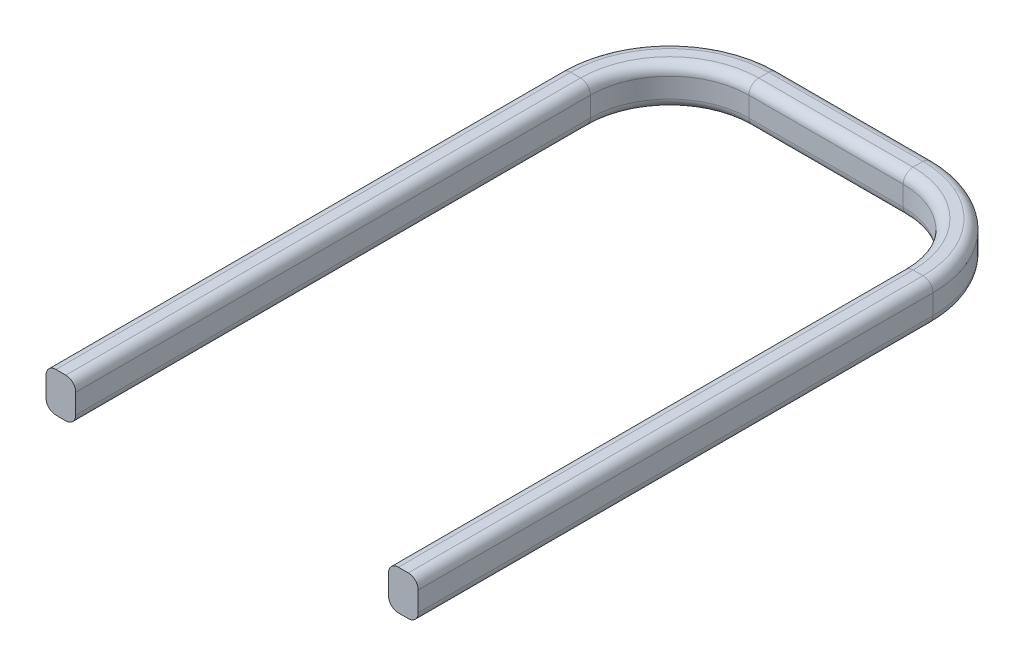
ISO-10303-21;
HEADER;
FILE_DESCRIPTION(('STEP AP214'),'2;1');
FILE_NAME('part.step','',(''),(''),'','','');
FILE_SCHEMA(('AUTOMOTIVE_DESIGN { 1 0 10303 214 1 1 1 1 }'));
ENDSEC;
DATA;
#1=APPLICATION_CONTEXT('core data for automotive mechanical design processes');
#2=APPLICATION_PROTOCOL_DEFINITION('international standard','automotive_design',2000,#1);
#3=PRODUCT_CONTEXT('',#1,'mechanical');
#4=PRODUCT('Part','Part','',(#3));
#5=PRODUCT_RELATED_PRODUCT_CATEGORY('part','',(#4));
#6=PRODUCT_DEFINITION_FORMATION('','',#4);
#7=PRODUCT_DEFINITION_CONTEXT('part definition',#1,'design');
#8=PRODUCT_DEFINITION('design','',#6,#7);
#9=PRODUCT_DEFINITION_SHAPE('','',#8);
#10=(LENGTH_UNIT() NAMED_UNIT(*) SI_UNIT(.MILLI.,.METRE.));
#11=(NAMED_UNIT(*) PLANE_ANGLE_UNIT() SI_UNIT($,.RADIAN.));
#12=(NAMED_UNIT(*) SI_UNIT($,.STERADIAN.) SOLID_ANGLE_UNIT());
#13=UNCERTAINTY_MEASURE_WITH_UNIT(LENGTH_MEASURE(1.E-05),#10,'distance_accuracy_value','');
#14=(GEOMETRIC_REPRESENTATION_CONTEXT(3) GLOBAL_UNCERTAINTY_ASSIGNED_CONTEXT((#13)) GLOBAL_UNIT_ASSIGNED_CONTEXT((#10,
#11,#12)) REPRESENTATION_CONTEXT('',''));
#15=CARTESIAN_POINT('',(0.,0.,0.));
#16=DIRECTION('',(0.,0.,1.));
#17=DIRECTION('',(1.,0.,0.));
#18=AXIS2_PLACEMENT_3D('',#15,#16,#17);
#19=CARTESIAN_POINT('',(0.,0.,0.));
#20=DIRECTION('',(0.,0.,1.));
#21=DIRECTION('',(1.,0.,0.));
#22=AXIS2_PLACEMENT_3D('',#19,#20,#21);
#23=PLANE('',#22);
#24=DIRECTION('',(0.,-1.,0.));
#25=VECTOR('',#24,1.);
#26=CARTESIAN_POINT('',(-4.7,0.,0.));
#27=LINE('',#26,#25);
#28=CARTESIAN_POINT('',(-4.7,0.75,0.));
#29=VERTEX_POINT('',#28);
#30=CARTESIAN_POINT('',(-4.7,0.25,0.));
#31=VERTEX_POINT('',#30);
#32=EDGE_CURVE('E458',#29,#31,#27,.T.);
#33=ORIENTED_EDGE('',*,*,#32,.T.);
#34=CARTESIAN_POINT('',(-4.45,0.25,0.));
#35=DIRECTION('',(0.,0.,1.));
#36=DIRECTION('',(1.,0.,0.));
#37=AXIS2_PLACEMENT_3D('',#34,#35,#36);
#38=CIRCLE('',#37,0.25);
#39=CARTESIAN_POINT('',(-4.45,0.,0.));
#40=VERTEX_POINT('',#39);
#41=EDGE_CURVE('E362',#31,#40,#38,.T.);
#42=ORIENTED_EDGE('',*,*,#41,.T.);
#43=DIRECTION('',(1.,0.,0.));
#44=VECTOR('',#43,1.);
#45=CARTESIAN_POINT('',(-3.95,0.,0.));
#46=LINE('',#45,#44);
#47=CARTESIAN_POINT('',(-4.2,0.,0.));
#48=VERTEX_POINT('',#47);
#49=EDGE_CURVE('E464',#40,#48,#46,.T.);
#50=ORIENTED_EDGE('',*,*,#49,.T.);
#51=CARTESIAN_POINT('',(-4.2,0.25,0.));
#52=DIRECTION('',(0.,0.,1.));
#53=DIRECTION('',(1.,0.,0.));
#54=AXIS2_PLACEMENT_3D('',#51,#52,#53);
#55=CIRCLE('',#54,0.25);
#56=CARTESIAN_POINT('',(-3.95,0.25,0.));
#57=VERTEX_POINT('',#56);
#58=EDGE_CURVE('E356',#48,#57,#55,.T.);
#59=ORIENTED_EDGE('',*,*,#58,.T.);
#60=DIRECTION('',(0.,1.,0.));
#61=VECTOR('',#60,1.);
#62=CARTESIAN_POINT('',(-3.95,0.,0.));
#63=LINE('',#62,#61);
#64=CARTESIAN_POINT('',(-3.95,0.75,0.));
#65=VERTEX_POINT('',#64);
#66=EDGE_CURVE('E388',#57,#65,#63,.T.);
#67=ORIENTED_EDGE('',*,*,#66,.T.);
#68=CARTESIAN_POINT('',(-4.2,0.75,0.));
#69=DIRECTION('',(0.,0.,1.));
#70=DIRECTION('',(1.,0.,0.));
#71=AXIS2_PLACEMENT_3D('',#68,#69,#70);
#72=CIRCLE('',#71,0.25);
#73=CARTESIAN_POINT('',(-4.2,1.,0.));
#74=VERTEX_POINT('',#73);
#75=EDGE_CURVE('E64',#65,#74,#72,.T.);
#76=ORIENTED_EDGE('',*,*,#75,.T.);
#77=DIRECTION('',(-1.,0.,0.));
#78=VECTOR('',#77,1.);
#79=CARTESIAN_POINT('',(-3.95,1.,0.));
#80=LINE('',#79,#78);
#81=CARTESIAN_POINT('',(-4.45,1.,0.));
#82=VERTEX_POINT('',#81);
#83=EDGE_CURVE('E455',#74,#82,#80,.T.);
#84=ORIENTED_EDGE('',*,*,#83,.T.);
#85=CARTESIAN_POINT('',(-4.45,0.75,0.));
#86=DIRECTION('',(0.,0.,1.));
#87=DIRECTION('',(1.,0.,0.));
#88=AXIS2_PLACEMENT_3D('',#85,#86,#87);
#89=CIRCLE('',#88,0.25);
#90=EDGE_CURVE('E359',#82,#29,#89,.T.);
#91=ORIENTED_EDGE('',*,*,#90,.T.);
#92=EDGE_LOOP('',(#33,#42,#50,#59,#67,#76,#84,#91));
#93=FACE_BOUND('',#92,.T.);
#94=ADVANCED_FACE('F39',(#93),#23,.T.);
#95=CARTESIAN_POINT('',(0.,0.,0.));
#96=DIRECTION('',(0.,0.,-1.));
#97=DIRECTION('',(-1.,0.,0.));
#98=AXIS2_PLACEMENT_3D('',#95,#96,#97);
#99=PLANE('',#98);
#100=DIRECTION('',(-1.,0.,0.));
#101=VECTOR('',#100,1.);
#102=CARTESIAN_POINT('',(3.95,0.,0.));
#103=LINE('',#102,#101);
#104=CARTESIAN_POINT('',(4.45,0.,0.));
#105=VERTEX_POINT('',#104);
#106=CARTESIAN_POINT('',(4.2,0.,0.));
#107=VERTEX_POINT('',#106);
#108=EDGE_CURVE('E222',#105,#107,#103,.T.);
#109=ORIENTED_EDGE('',*,*,#108,.F.);
#110=CARTESIAN_POINT('',(4.45,0.25,0.));
#111=DIRECTION('',(0.,0.,-1.));
#112=DIRECTION('',(-1.,0.,0.));
#113=AXIS2_PLACEMENT_3D('',#110,#111,#112);
#114=CIRCLE('',#113,0.25);
#115=CARTESIAN_POINT('',(4.7,0.25,0.));
#116=VERTEX_POINT('',#115);
#117=EDGE_CURVE('E204',#105,#116,#114,.F.);
#118=ORIENTED_EDGE('',*,*,#117,.T.);
#119=DIRECTION('',(0.,-1.,0.));
#120=VECTOR('',#119,1.);
#121=CARTESIAN_POINT('',(4.7,0.,0.));
#122=LINE('',#121,#120);
#123=CARTESIAN_POINT('',(4.7,0.75,0.));
#124=VERTEX_POINT('',#123);
#125=EDGE_CURVE('E235',#124,#116,#122,.T.);
#126=ORIENTED_EDGE('',*,*,#125,.F.);
#127=CARTESIAN_POINT('',(4.45,0.75,0.));
#128=DIRECTION('',(0.,0.,-1.));
#129=DIRECTION('',(-1.,0.,0.));
#130=AXIS2_PLACEMENT_3D('',#127,#128,#129);
#131=CIRCLE('',#130,0.25);
#132=CARTESIAN_POINT('',(4.45,1.,0.));
#133=VERTEX_POINT('',#132);
#134=EDGE_CURVE('E216',#124,#133,#131,.F.);
#135=ORIENTED_EDGE('',*,*,#134,.T.);
#136=DIRECTION('',(1.,0.,0.));
#137=VECTOR('',#136,1.);
#138=CARTESIAN_POINT('',(3.95,1.,0.));
#139=LINE('',#138,#137);
#140=CARTESIAN_POINT('',(4.2,1.,0.));
#141=VERTEX_POINT('',#140);
#142=EDGE_CURVE('E240',#141,#133,#139,.T.);
#143=ORIENTED_EDGE('',*,*,#142,.F.);
#144=CARTESIAN_POINT('',(4.2,0.75,0.));
#145=DIRECTION('',(0.,0.,-1.));
#146=DIRECTION('',(-1.,0.,0.));
#147=AXIS2_PLACEMENT_3D('',#144,#145,#146);
#148=CIRCLE('',#147,0.25);
#149=CARTESIAN_POINT('',(3.95,0.75,0.));
#150=VERTEX_POINT('',#149);
#151=EDGE_CURVE('E228',#141,#150,#148,.F.);
#152=ORIENTED_EDGE('',*,*,#151,.T.);
#153=DIRECTION('',(0.,1.,0.));
#154=VECTOR('',#153,1.);
#155=CARTESIAN_POINT('',(3.95,0.,0.));
#156=LINE('',#155,#154);
#157=CARTESIAN_POINT('',(3.95,0.25,0.));
#158=VERTEX_POINT('',#157);
#159=EDGE_CURVE('E483',#158,#150,#156,.T.);
#160=ORIENTED_EDGE('',*,*,#159,.F.);
#161=CARTESIAN_POINT('',(4.2,0.25,0.));
#162=DIRECTION('',(0.,0.,-1.));
#163=DIRECTION('',(-1.,0.,0.));
#164=AXIS2_PLACEMENT_3D('',#161,#162,#163);
#165=CIRCLE('',#164,0.25);
#166=EDGE_CURVE('E233',#158,#107,#165,.F.);
#167=ORIENTED_EDGE('',*,*,#166,.T.);
#168=EDGE_LOOP('',(#109,#118,#126,#135,#143,#152,#160,#167));
#169=FACE_BOUND('',#168,.T.);
#170=ADVANCED_FACE('F231',(#169),#99,.F.);
#171=CARTESIAN_POINT('',(-3.95,0.,0.));
#172=DIRECTION('',(-1.,0.,0.));
#173=DIRECTION('',(0.,0.,1.));
#174=AXIS2_PLACEMENT_3D('',#171,#172,#173);
#175=PLANE('',#174);
#176=ORIENTED_EDGE('',*,*,#66,.F.);
#177=DIRECTION('',(0.,0.,-1.));
#178=VECTOR('',#177,1.);
#179=CARTESIAN_POINT('',(-3.95,0.25,0.));
#180=LINE('',#179,#178);
#181=CARTESIAN_POINT('',(-3.95,0.25,-13.));
#182=VERTEX_POINT('',#181);
#183=EDGE_CURVE('E11',#57,#182,#180,.T.);
#184=ORIENTED_EDGE('',*,*,#183,.T.);
#185=DIRECTION('',(0.,1.,0.));
#186=VECTOR('',#185,1.);
#187=CARTESIAN_POINT('',(-3.95,0.,-13.));
#188=LINE('',#187,#186);
#189=CARTESIAN_POINT('',(-3.95,0.75,-13.));
#190=VERTEX_POINT('',#189);
#191=EDGE_CURVE('E450',#182,#190,#188,.T.);
#192=ORIENTED_EDGE('',*,*,#191,.T.);
#193=DIRECTION('',(0.,0.,-1.));
#194=VECTOR('',#193,1.);
#195=CARTESIAN_POINT('',(-3.95,0.75,0.));
#196=LINE('',#195,#194);
#197=EDGE_CURVE('E49',#190,#65,#196,.F.);
#198=ORIENTED_EDGE('',*,*,#197,.T.);
#199=EDGE_LOOP('',(#176,#184,#192,#198));
#200=FACE_BOUND('',#199,.T.);
#201=ADVANCED_FACE('F447',(#200),#175,.F.);
#202=CARTESIAN_POINT('',(-3.95,1.,0.));
#203=DIRECTION('',(0.,-1.,0.));
#204=DIRECTION('',(0.,0.,-1.));
#205=AXIS2_PLACEMENT_3D('',#202,#203,#204);
#206=PLANE('',#205);
#207=DIRECTION('',(-1.,0.,0.));
#208=VECTOR('',#207,1.);
#209=CARTESIAN_POINT('',(-3.95,1.,-13.));
#210=LINE('',#209,#208);
#211=CARTESIAN_POINT('',(-4.2,1.,-13.));
#212=VERTEX_POINT('',#211);
#213=CARTESIAN_POINT('',(-4.45,1.,-13.));
#214=VERTEX_POINT('',#213);
#215=EDGE_CURVE('E463',#212,#214,#210,.T.);
#216=ORIENTED_EDGE('',*,*,#215,.T.);
#217=DIRECTION('',(0.,0.,-1.));
#218=VECTOR('',#217,1.);
#219=CARTESIAN_POINT('',(-4.45,1.,0.));
#220=LINE('',#219,#218);
#221=EDGE_CURVE('E57',#214,#82,#220,.F.);
#222=ORIENTED_EDGE('',*,*,#221,.T.);
#223=ORIENTED_EDGE('',*,*,#83,.F.);
#224=DIRECTION('',(0.,0.,-1.));
#225=VECTOR('',#224,1.);
#226=CARTESIAN_POINT('',(-4.2,1.,0.));
#227=LINE('',#226,#225);
#228=EDGE_CURVE('E365',#74,#212,#227,.T.);
#229=ORIENTED_EDGE('',*,*,#228,.T.);
#230=EDGE_LOOP('',(#216,#222,#223,#229));
#231=FACE_BOUND('',#230,.T.);
#232=ADVANCED_FACE('F879',(#231),#206,.F.);
#233=CARTESIAN_POINT('',(-4.7,0.,0.));
#234=DIRECTION('',(1.,0.,0.));
#235=DIRECTION('',(0.,0.,-1.));
#236=AXIS2_PLACEMENT_3D('',#233,#234,#235);
#237=PLANE('',#236);
#238=DIRECTION('',(0.,-1.,0.));
#239=VECTOR('',#238,1.);
#240=CARTESIAN_POINT('',(-4.7,0.,-13.));
#241=LINE('',#240,#239);
#242=CARTESIAN_POINT('',(-4.7,0.75,-13.));
#243=VERTEX_POINT('',#242);
#244=CARTESIAN_POINT('',(-4.7,0.25,-13.));
#245=VERTEX_POINT('',#244);
#246=EDGE_CURVE('E489',#243,#245,#241,.T.);
#247=ORIENTED_EDGE('',*,*,#246,.T.);
#248=DIRECTION('',(0.,0.,-1.));
#249=VECTOR('',#248,1.);
#250=CARTESIAN_POINT('',(-4.7,0.25,0.));
#251=LINE('',#250,#249);
#252=EDGE_CURVE('E351',#245,#31,#251,.F.);
#253=ORIENTED_EDGE('',*,*,#252,.T.);
#254=ORIENTED_EDGE('',*,*,#32,.F.);
#255=DIRECTION('',(0.,0.,-1.));
#256=VECTOR('',#255,1.);
#257=CARTESIAN_POINT('',(-4.7,0.75,0.));
#258=LINE('',#257,#256);
#259=EDGE_CURVE('E348',#29,#243,#258,.T.);
#260=ORIENTED_EDGE('',*,*,#259,.T.);
#261=EDGE_LOOP('',(#247,#253,#254,#260));
#262=FACE_BOUND('',#261,.T.);
#263=ADVANCED_FACE('F869',(#262),#237,.F.);
#264=CARTESIAN_POINT('',(-3.95,0.,0.));
#265=DIRECTION('',(0.,1.,0.));
#266=DIRECTION('',(-1.,0.,0.));
#267=AXIS2_PLACEMENT_3D('',#264,#265,#266);
#268=PLANE('',#267);
#269=ORIENTED_EDGE('',*,*,#49,.F.);
#270=DIRECTION('',(0.,0.,-1.));
#271=VECTOR('',#270,1.);
#272=CARTESIAN_POINT('',(-4.45,0.,0.));
#273=LINE('',#272,#271);
#274=CARTESIAN_POINT('',(-4.45,0.,-13.));
#275=VERTEX_POINT('',#274);
#276=EDGE_CURVE('E345',#40,#275,#273,.T.);
#277=ORIENTED_EDGE('',*,*,#276,.T.);
#278=DIRECTION('',(1.,0.,0.));
#279=VECTOR('',#278,1.);
#280=CARTESIAN_POINT('',(-3.95,0.,-13.));
#281=LINE('',#280,#279);
#282=CARTESIAN_POINT('',(-4.2,0.,-13.));
#283=VERTEX_POINT('',#282);
#284=EDGE_CURVE('E470',#275,#283,#281,.T.);
#285=ORIENTED_EDGE('',*,*,#284,.T.);
#286=DIRECTION('',(0.,0.,-1.));
#287=VECTOR('',#286,1.);
#288=CARTESIAN_POINT('',(-4.2,0.,0.));
#289=LINE('',#288,#287);
#290=EDGE_CURVE('E342',#283,#48,#289,.F.);
#291=ORIENTED_EDGE('',*,*,#290,.T.);
#292=EDGE_LOOP('',(#269,#277,#285,#291));
#293=FACE_BOUND('',#292,.T.);
#294=ADVANCED_FACE('F859',(#293),#268,.F.);
#295=CARTESIAN_POINT('',(-1.95,0.,-13.));
#296=DIRECTION('',(0.,-1.,0.));
#297=DIRECTION('',(0.,0.,-1.));
#298=AXIS2_PLACEMENT_3D('',#295,#296,#297);
#299=CYLINDRICAL_SURFACE('',#298,2.);
#300=ORIENTED_EDGE('',*,*,#191,.F.);
#301=CARTESIAN_POINT('',(-1.95,0.25,-13.));
#302=DIRECTION('',(0.,1.,0.));
#303=DIRECTION('',(0.,0.,1.));
#304=AXIS2_PLACEMENT_3D('',#301,#302,#303);
#305=CIRCLE('',#304,2.);
#306=CARTESIAN_POINT('',(-1.95,0.25,-15.));
#307=VERTEX_POINT('',#306);
#308=EDGE_CURVE('E339',#182,#307,#305,.F.);
#309=ORIENTED_EDGE('',*,*,#308,.T.);
#310=DIRECTION('',(0.,1.,0.));
#311=VECTOR('',#310,1.);
#312=CARTESIAN_POINT('',(-1.95,0.,-15.));
#313=LINE('',#312,#311);
#314=CARTESIAN_POINT('',(-1.95,0.75,-15.));
#315=VERTEX_POINT('',#314);
#316=EDGE_CURVE('E465',#307,#315,#313,.T.);
#317=ORIENTED_EDGE('',*,*,#316,.T.);
#318=CARTESIAN_POINT('',(-1.95,0.75,-13.));
#319=DIRECTION('',(0.,-1.,0.));
#320=DIRECTION('',(0.,0.,-1.));
#321=AXIS2_PLACEMENT_3D('',#318,#319,#320);
#322=CIRCLE('',#321,2.);
#323=EDGE_CURVE('E336',#315,#190,#322,.F.);
#324=ORIENTED_EDGE('',*,*,#323,.T.);
#325=EDGE_LOOP('',(#300,#309,#317,#324));
#326=FACE_BOUND('',#325,.T.);
#327=ADVANCED_FACE('F849',(#326),#299,.F.);
#328=CARTESIAN_POINT('',(-3.95,1.,-13.));
#329=DIRECTION('',(0.,-1.,0.));
#330=DIRECTION('',(0.,0.,-1.));
#331=AXIS2_PLACEMENT_3D('',#328,#329,#330);
#332=PLANE('',#331);
#333=DIRECTION('',(0.,0.,-1.));
#334=VECTOR('',#333,1.);
#335=CARTESIAN_POINT('',(-1.95,1.,-15.));
#336=LINE('',#335,#334);
#337=CARTESIAN_POINT('',(-1.95,1.,-15.25));
#338=VERTEX_POINT('',#337);
#339=CARTESIAN_POINT('',(-1.95,1.,-15.5));
#340=VERTEX_POINT('',#339);
#341=EDGE_CURVE('E469',#338,#340,#336,.T.);
#342=ORIENTED_EDGE('',*,*,#341,.T.);
#343=CARTESIAN_POINT('',(-1.95,1.,-13.));
#344=DIRECTION('',(0.,-1.,0.));
#345=DIRECTION('',(0.,0.,-1.));
#346=AXIS2_PLACEMENT_3D('',#343,#344,#345);
#347=CIRCLE('',#346,2.5);
#348=EDGE_CURVE('E314',#340,#214,#347,.F.);
#349=ORIENTED_EDGE('',*,*,#348,.T.);
#350=ORIENTED_EDGE('',*,*,#215,.F.);
#351=CARTESIAN_POINT('',(-1.95,1.,-13.));
#352=DIRECTION('',(0.,-1.,0.));
#353=DIRECTION('',(0.,0.,-1.));
#354=AXIS2_PLACEMENT_3D('',#351,#352,#353);
#355=CIRCLE('',#354,2.25);
#356=EDGE_CURVE('E311',#212,#338,#355,.T.);
#357=ORIENTED_EDGE('',*,*,#356,.T.);
#358=EDGE_LOOP('',(#342,#349,#350,#357));
#359=FACE_BOUND('',#358,.T.);
#360=ADVANCED_FACE('F839',(#359),#332,.F.);
#361=CARTESIAN_POINT('',(-1.95,0.,-13.));
#362=DIRECTION('',(0.,-1.,0.));
#363=DIRECTION('',(0.,0.,-1.));
#364=AXIS2_PLACEMENT_3D('',#361,#362,#363);
#365=CYLINDRICAL_SURFACE('',#364,2.75);
#366=DIRECTION('',(0.,-1.,0.));
#367=VECTOR('',#366,1.);
#368=CARTESIAN_POINT('',(-1.95,0.,-15.75));
#369=LINE('',#368,#367);
#370=CARTESIAN_POINT('',(-1.95,0.75,-15.75));
#371=VERTEX_POINT('',#370);
#372=CARTESIAN_POINT('',(-1.95,0.25,-15.75));
#373=VERTEX_POINT('',#372);
#374=EDGE_CURVE('E493',#371,#373,#369,.T.);
#375=ORIENTED_EDGE('',*,*,#374,.T.);
#376=CARTESIAN_POINT('',(-1.95,0.25,-13.));
#377=DIRECTION('',(0.,1.,0.));
#378=DIRECTION('',(0.,0.,1.));
#379=AXIS2_PLACEMENT_3D('',#376,#377,#378);
#380=CIRCLE('',#379,2.75);
#381=EDGE_CURVE('E289',#373,#245,#380,.T.);
#382=ORIENTED_EDGE('',*,*,#381,.T.);
#383=ORIENTED_EDGE('',*,*,#246,.F.);
#384=CARTESIAN_POINT('',(-1.95,0.75,-13.));
#385=DIRECTION('',(0.,-1.,0.));
#386=DIRECTION('',(0.,0.,-1.));
#387=AXIS2_PLACEMENT_3D('',#384,#385,#386);
#388=CIRCLE('',#387,2.75);
#389=EDGE_CURVE('E286',#243,#371,#388,.T.);
#390=ORIENTED_EDGE('',*,*,#389,.T.);
#391=EDGE_LOOP('',(#375,#382,#383,#390));
#392=FACE_BOUND('',#391,.T.);
#393=ADVANCED_FACE('F829',(#392),#365,.T.);
#394=CARTESIAN_POINT('',(-3.95,0.,-13.));
#395=DIRECTION('',(0.,1.,0.));
#396=DIRECTION('',(0.,0.,1.));
#397=AXIS2_PLACEMENT_3D('',#394,#395,#396);
#398=PLANE('',#397);
#399=ORIENTED_EDGE('',*,*,#284,.F.);
#400=CARTESIAN_POINT('',(-1.95,0.,-13.));
#401=DIRECTION('',(0.,1.,0.));
#402=DIRECTION('',(0.,0.,1.));
#403=AXIS2_PLACEMENT_3D('',#400,#401,#402);
#404=CIRCLE('',#403,2.5);
#405=CARTESIAN_POINT('',(-1.95,0.,-15.5));
#406=VERTEX_POINT('',#405);
#407=EDGE_CURVE('E283',#275,#406,#404,.F.);
#408=ORIENTED_EDGE('',*,*,#407,.T.);
#409=DIRECTION('',(0.,0.,1.));
#410=VECTOR('',#409,1.);
#411=CARTESIAN_POINT('',(-1.95,0.,-15.));
#412=LINE('',#411,#410);
#413=CARTESIAN_POINT('',(-1.95,0.,-15.25));
#414=VERTEX_POINT('',#413);
#415=EDGE_CURVE('E476',#406,#414,#412,.T.);
#416=ORIENTED_EDGE('',*,*,#415,.T.);
#417=CARTESIAN_POINT('',(-1.95,0.,-13.));
#418=DIRECTION('',(0.,1.,0.));
#419=DIRECTION('',(0.,0.,1.));
#420=AXIS2_PLACEMENT_3D('',#417,#418,#419);
#421=CIRCLE('',#420,2.25);
#422=EDGE_CURVE('E280',#414,#283,#421,.T.);
#423=ORIENTED_EDGE('',*,*,#422,.T.);
#424=EDGE_LOOP('',(#399,#408,#416,#423));
#425=FACE_BOUND('',#424,.T.);
#426=ADVANCED_FACE('F820',(#425),#398,.F.);
#427=CARTESIAN_POINT('',(-1.95,0.,-15.));
#428=DIRECTION('',(0.,0.,-1.));
#429=DIRECTION('',(-1.,0.,0.));
#430=AXIS2_PLACEMENT_3D('',#427,#428,#429);
#431=PLANE('',#430);
#432=ORIENTED_EDGE('',*,*,#316,.F.);
#433=DIRECTION('',(1.,0.,0.));
#434=VECTOR('',#433,1.);
#435=CARTESIAN_POINT('',(-1.95,0.25,-15.));
#436=LINE('',#435,#434);
#437=CARTESIAN_POINT('',(1.94999999999999,0.25,-15.));
#438=VERTEX_POINT('',#437);
#439=EDGE_CURVE('E333',#307,#438,#436,.T.);
#440=ORIENTED_EDGE('',*,*,#439,.T.);
#441=DIRECTION('',(0.,1.,0.));
#442=VECTOR('',#441,1.);
#443=CARTESIAN_POINT('',(1.94999999999999,0.,-15.));
#444=LINE('',#443,#442);
#445=CARTESIAN_POINT('',(1.94999999999999,0.75,-15.));
#446=VERTEX_POINT('',#445);
#447=EDGE_CURVE('E471',#438,#446,#444,.T.);
#448=ORIENTED_EDGE('',*,*,#447,.T.);
#449=DIRECTION('',(1.,0.,0.));
#450=VECTOR('',#449,1.);
#451=CARTESIAN_POINT('',(-1.95,0.75,-15.));
#452=LINE('',#451,#450);
#453=EDGE_CURVE('E330',#446,#315,#452,.F.);
#454=ORIENTED_EDGE('',*,*,#453,.T.);
#455=EDGE_LOOP('',(#432,#440,#448,#454));
#456=FACE_BOUND('',#455,.T.);
#457=ADVANCED_FACE('F565',(#456),#431,.F.);
#458=CARTESIAN_POINT('',(-1.95,1.,-15.));
#459=DIRECTION('',(0.,-1.,0.));
#460=DIRECTION('',(0.,0.,-1.));
#461=AXIS2_PLACEMENT_3D('',#458,#459,#460);
#462=PLANE('',#461);
#463=DIRECTION('',(0.,0.,-1.));
#464=VECTOR('',#463,1.);
#465=CARTESIAN_POINT('',(1.94999999999999,1.,-15.));
#466=LINE('',#465,#464);
#467=CARTESIAN_POINT('',(1.94999999999999,1.,-15.25));
#468=VERTEX_POINT('',#467);
#469=CARTESIAN_POINT('',(1.94999999999999,1.,-15.5));
#470=VERTEX_POINT('',#469);
#471=EDGE_CURVE('E475',#468,#470,#466,.T.);
#472=ORIENTED_EDGE('',*,*,#471,.T.);
#473=DIRECTION('',(1.,0.,0.));
#474=VECTOR('',#473,1.);
#475=CARTESIAN_POINT('',(-1.95,1.,-15.5));
#476=LINE('',#475,#474);
#477=EDGE_CURVE('E308',#470,#340,#476,.F.);
#478=ORIENTED_EDGE('',*,*,#477,.T.);
#479=ORIENTED_EDGE('',*,*,#341,.F.);
#480=DIRECTION('',(1.,0.,0.));
#481=VECTOR('',#480,1.);
#482=CARTESIAN_POINT('',(-1.95,1.,-15.25));
#483=LINE('',#482,#481);
#484=EDGE_CURVE('E305',#338,#468,#483,.T.);
#485=ORIENTED_EDGE('',*,*,#484,.T.);
#486=EDGE_LOOP('',(#472,#478,#479,#485));
#487=FACE_BOUND('',#486,.T.);
#488=ADVANCED_FACE('F570',(#487),#462,.F.);
#489=CARTESIAN_POINT('',(-1.95,0.,-15.75));
#490=DIRECTION('',(0.,0.,1.));
#491=DIRECTION('',(1.,0.,0.));
#492=AXIS2_PLACEMENT_3D('',#489,#490,#491);
#493=PLANE('',#492);
#494=DIRECTION('',(0.,-1.,0.));
#495=VECTOR('',#494,1.);
#496=CARTESIAN_POINT('',(1.94999999999999,0.,-15.75));
#497=LINE('',#496,#495);
#498=CARTESIAN_POINT('',(1.94999999999999,0.75,-15.75));
#499=VERTEX_POINT('',#498);
#500=CARTESIAN_POINT('',(1.94999999999999,0.25,-15.75));
#501=VERTEX_POINT('',#500);
#502=EDGE_CURVE('E497',#499,#501,#497,.T.);
#503=ORIENTED_EDGE('',*,*,#502,.T.);
#504=DIRECTION('',(1.,0.,0.));
#505=VECTOR('',#504,1.);
#506=CARTESIAN_POINT('',(-1.95,0.25,-15.75));
#507=LINE('',#506,#505);
#508=EDGE_CURVE('E277',#501,#373,#507,.F.);
#509=ORIENTED_EDGE('',*,*,#508,.T.);
#510=ORIENTED_EDGE('',*,*,#374,.F.);
#511=DIRECTION('',(1.,0.,0.));
#512=VECTOR('',#511,1.);
#513=CARTESIAN_POINT('',(-1.95,0.75,-15.75));
#514=LINE('',#513,#512);
#515=EDGE_CURVE('E274',#371,#499,#514,.T.);
#516=ORIENTED_EDGE('',*,*,#515,.T.);
#517=EDGE_LOOP('',(#503,#509,#510,#516));
#518=FACE_BOUND('',#517,.T.);
#519=ADVANCED_FACE('F795',(#518),#493,.F.);
#520=CARTESIAN_POINT('',(-1.95,0.,-15.));
#521=DIRECTION('',(0.,1.,0.));
#522=DIRECTION('',(0.,0.,1.));
#523=AXIS2_PLACEMENT_3D('',#520,#521,#522);
#524=PLANE('',#523);
#525=ORIENTED_EDGE('',*,*,#415,.F.);
#526=DIRECTION('',(1.,0.,0.));
#527=VECTOR('',#526,1.);
#528=CARTESIAN_POINT('',(-1.95,0.,-15.5));
#529=LINE('',#528,#527);
#530=CARTESIAN_POINT('',(1.94999999999999,0.,-15.5));
#531=VERTEX_POINT('',#530);
#532=EDGE_CURVE('E271',#406,#531,#529,.T.);
#533=ORIENTED_EDGE('',*,*,#532,.T.);
#534=DIRECTION('',(0.,0.,1.));
#535=VECTOR('',#534,1.);
#536=CARTESIAN_POINT('',(1.94999999999999,0.,-15.));
#537=LINE('',#536,#535);
#538=CARTESIAN_POINT('',(1.94999999999999,0.,-15.25));
#539=VERTEX_POINT('',#538);
#540=EDGE_CURVE('E482',#531,#539,#537,.T.);
#541=ORIENTED_EDGE('',*,*,#540,.T.);
#542=DIRECTION('',(1.,0.,0.));
#543=VECTOR('',#542,1.);
#544=CARTESIAN_POINT('',(-1.95,0.,-15.25));
#545=LINE('',#544,#543);
#546=EDGE_CURVE('E268',#539,#414,#545,.F.);
#547=ORIENTED_EDGE('',*,*,#546,.T.);
#548=EDGE_LOOP('',(#525,#533,#541,#547));
#549=FACE_BOUND('',#548,.T.);
#550=ADVANCED_FACE('F532',(#549),#524,.F.);
#551=CARTESIAN_POINT('',(1.95,0.,-13.));
#552=DIRECTION('',(0.,-1.,0.));
#553=DIRECTION('',(0.,0.,-1.));
#554=AXIS2_PLACEMENT_3D('',#551,#552,#553);
#555=CYLINDRICAL_SURFACE('',#554,2.);
#556=ORIENTED_EDGE('',*,*,#447,.F.);
#557=CARTESIAN_POINT('',(1.95,0.25,-13.));
#558=DIRECTION('',(0.,1.,0.));
#559=DIRECTION('',(0.,0.,1.));
#560=AXIS2_PLACEMENT_3D('',#557,#558,#559);
#561=CIRCLE('',#560,2.);
#562=CARTESIAN_POINT('',(3.95,0.25,-13.));
#563=VERTEX_POINT('',#562);
#564=EDGE_CURVE('E327',#438,#563,#561,.F.);
#565=ORIENTED_EDGE('',*,*,#564,.T.);
#566=DIRECTION('',(0.,1.,0.));
#567=VECTOR('',#566,1.);
#568=CARTESIAN_POINT('',(3.95,0.,-13.));
#569=LINE('',#568,#567);
#570=CARTESIAN_POINT('',(3.95,0.75,-13.));
#571=VERTEX_POINT('',#570);
#572=EDGE_CURVE('E477',#563,#571,#569,.T.);
#573=ORIENTED_EDGE('',*,*,#572,.T.);
#574=CARTESIAN_POINT('',(1.95,0.75,-13.));
#575=DIRECTION('',(0.,-1.,0.));
#576=DIRECTION('',(0.,0.,-1.));
#577=AXIS2_PLACEMENT_3D('',#574,#575,#576);
#578=CIRCLE('',#577,2.);
#579=EDGE_CURVE('E324',#571,#446,#578,.F.);
#580=ORIENTED_EDGE('',*,*,#579,.T.);
#581=EDGE_LOOP('',(#556,#565,#573,#580));
#582=FACE_BOUND('',#581,.T.);
#583=ADVANCED_FACE('F550',(#582),#555,.F.);
#584=CARTESIAN_POINT('',(1.94999999999999,1.,-15.));
#585=DIRECTION('',(0.,-1.,0.));
#586=DIRECTION('',(0.,0.,-1.));
#587=AXIS2_PLACEMENT_3D('',#584,#585,#586);
#588=PLANE('',#587);
#589=DIRECTION('',(1.,0.,0.));
#590=VECTOR('',#589,1.);
#591=CARTESIAN_POINT('',(3.95,1.,-13.));
#592=LINE('',#591,#590);
#593=CARTESIAN_POINT('',(4.2,1.,-13.));
#594=VERTEX_POINT('',#593);
#595=CARTESIAN_POINT('',(4.45,1.,-13.));
#596=VERTEX_POINT('',#595);
#597=EDGE_CURVE('E481',#594,#596,#592,.T.);
#598=ORIENTED_EDGE('',*,*,#597,.T.);
#599=CARTESIAN_POINT('',(1.95,1.,-13.));
#600=DIRECTION('',(0.,-1.,0.));
#601=DIRECTION('',(0.,0.,-1.));
#602=AXIS2_PLACEMENT_3D('',#599,#600,#601);
#603=CIRCLE('',#602,2.5);
#604=EDGE_CURVE('E302',#596,#470,#603,.F.);
#605=ORIENTED_EDGE('',*,*,#604,.T.);
#606=ORIENTED_EDGE('',*,*,#471,.F.);
#607=CARTESIAN_POINT('',(1.95,1.,-13.));
#608=DIRECTION('',(0.,-1.,0.));
#609=DIRECTION('',(0.,0.,-1.));
#610=AXIS2_PLACEMENT_3D('',#607,#608,#609);
#611=CIRCLE('',#610,2.25);
#612=EDGE_CURVE('E299',#468,#594,#611,.T.);
#613=ORIENTED_EDGE('',*,*,#612,.T.);
#614=EDGE_LOOP('',(#598,#605,#606,#613));
#615=FACE_BOUND('',#614,.T.);
#616=ADVANCED_FACE('F573',(#615),#588,.F.);
#617=CARTESIAN_POINT('',(1.95,0.,-13.));
#618=DIRECTION('',(0.,-1.,0.));
#619=DIRECTION('',(0.,0.,-1.));
#620=AXIS2_PLACEMENT_3D('',#617,#618,#619);
#621=CYLINDRICAL_SURFACE('',#620,2.75);
#622=DIRECTION('',(0.,-1.,0.));
#623=VECTOR('',#622,1.);
#624=CARTESIAN_POINT('',(4.7,0.,-13.));
#625=LINE('',#624,#623);
#626=CARTESIAN_POINT('',(4.7,0.75,-13.));
#627=VERTEX_POINT('',#626);
#628=CARTESIAN_POINT('',(4.7,0.25,-13.));
#629=VERTEX_POINT('',#628);
#630=EDGE_CURVE('E501',#627,#629,#625,.T.);
#631=ORIENTED_EDGE('',*,*,#630,.T.);
#632=CARTESIAN_POINT('',(1.95,0.25,-13.));
#633=DIRECTION('',(0.,1.,0.));
#634=DIRECTION('',(0.,0.,1.));
#635=AXIS2_PLACEMENT_3D('',#632,#633,#634);
#636=CIRCLE('',#635,2.75);
#637=EDGE_CURVE('E265',#629,#501,#636,.T.);
#638=ORIENTED_EDGE('',*,*,#637,.T.);
#639=ORIENTED_EDGE('',*,*,#502,.F.);
#640=CARTESIAN_POINT('',(1.95,0.75,-13.));
#641=DIRECTION('',(0.,-1.,0.));
#642=DIRECTION('',(0.,0.,-1.));
#643=AXIS2_PLACEMENT_3D('',#640,#641,#642);
#644=CIRCLE('',#643,2.75);
#645=EDGE_CURVE('E262',#499,#627,#644,.T.);
#646=ORIENTED_EDGE('',*,*,#645,.T.);
#647=EDGE_LOOP('',(#631,#638,#639,#646));
#648=FACE_BOUND('',#647,.T.);
#649=ADVANCED_FACE('F763',(#648),#621,.T.);
#650=CARTESIAN_POINT('',(1.94999999999999,0.,-15.));
#651=DIRECTION('',(0.,1.,0.));
#652=DIRECTION('',(0.,0.,1.));
#653=AXIS2_PLACEMENT_3D('',#650,#651,#652);
#654=PLANE('',#653);
#655=ORIENTED_EDGE('',*,*,#540,.F.);
#656=CARTESIAN_POINT('',(1.95,0.,-13.));
#657=DIRECTION('',(0.,1.,0.));
#658=DIRECTION('',(0.,0.,1.));
#659=AXIS2_PLACEMENT_3D('',#656,#657,#658);
#660=CIRCLE('',#659,2.5);
#661=CARTESIAN_POINT('',(4.45,0.,-13.));
#662=VERTEX_POINT('',#661);
#663=EDGE_CURVE('E259',#531,#662,#660,.F.);
#664=ORIENTED_EDGE('',*,*,#663,.T.);
#665=DIRECTION('',(-1.,0.,0.));
#666=VECTOR('',#665,1.);
#667=CARTESIAN_POINT('',(3.95,0.,-13.));
#668=LINE('',#667,#666);
#669=CARTESIAN_POINT('',(4.2,0.,-13.));
#670=VERTEX_POINT('',#669);
#671=EDGE_CURVE('E225',#662,#670,#668,.T.);
#672=ORIENTED_EDGE('',*,*,#671,.T.);
#673=CARTESIAN_POINT('',(1.95,0.,-13.));
#674=DIRECTION('',(0.,1.,0.));
#675=DIRECTION('',(0.,0.,1.));
#676=AXIS2_PLACEMENT_3D('',#673,#674,#675);
#677=CIRCLE('',#676,2.25);
#678=EDGE_CURVE('E256',#670,#539,#677,.T.);
#679=ORIENTED_EDGE('',*,*,#678,.T.);
#680=EDGE_LOOP('',(#655,#664,#672,#679));
#681=FACE_BOUND('',#680,.T.);
#682=ADVANCED_FACE('F598',(#681),#654,.F.);
#683=CARTESIAN_POINT('',(3.95,0.,-13.));
#684=DIRECTION('',(1.,0.,0.));
#685=DIRECTION('',(0.,0.,-1.));
#686=AXIS2_PLACEMENT_3D('',#683,#684,#685);
#687=PLANE('',#686);
#688=ORIENTED_EDGE('',*,*,#572,.F.);
#689=DIRECTION('',(0.,0.,1.));
#690=VECTOR('',#689,1.);
#691=CARTESIAN_POINT('',(3.95,0.25,-13.));
#692=LINE('',#691,#690);
#693=EDGE_CURVE('E320',#563,#158,#692,.T.);
#694=ORIENTED_EDGE('',*,*,#693,.T.);
#695=ORIENTED_EDGE('',*,*,#159,.T.);
#696=DIRECTION('',(0.,0.,1.));
#697=VECTOR('',#696,1.);
#698=CARTESIAN_POINT('',(3.95,0.75,-13.));
#699=LINE('',#698,#697);
#700=EDGE_CURVE('E317',#150,#571,#699,.F.);
#701=ORIENTED_EDGE('',*,*,#700,.T.);
#702=EDGE_LOOP('',(#688,#694,#695,#701));
#703=FACE_BOUND('',#702,.T.);
#704=ADVANCED_FACE('F553',(#703),#687,.F.);
#705=CARTESIAN_POINT('',(3.95,1.,-13.));
#706=DIRECTION('',(0.,-1.,0.));
#707=DIRECTION('',(0.,0.,-1.));
#708=AXIS2_PLACEMENT_3D('',#705,#706,#707);
#709=PLANE('',#708);
#710=ORIENTED_EDGE('',*,*,#142,.T.);
#711=DIRECTION('',(0.,0.,1.));
#712=VECTOR('',#711,1.);
#713=CARTESIAN_POINT('',(4.45,1.,-13.));
#714=LINE('',#713,#712);
#715=EDGE_CURVE('E296',#133,#596,#714,.F.);
#716=ORIENTED_EDGE('',*,*,#715,.T.);
#717=ORIENTED_EDGE('',*,*,#597,.F.);
#718=DIRECTION('',(0.,0.,1.));
#719=VECTOR('',#718,1.);
#720=CARTESIAN_POINT('',(4.2,1.,-13.));
#721=LINE('',#720,#719);
#722=EDGE_CURVE('E292',#594,#141,#721,.T.);
#723=ORIENTED_EDGE('',*,*,#722,.T.);
#724=EDGE_LOOP('',(#710,#716,#717,#723));
#725=FACE_BOUND('',#724,.T.);
#726=ADVANCED_FACE('F590',(#725),#709,.F.);
#727=CARTESIAN_POINT('',(4.7,0.,-13.));
#728=DIRECTION('',(-1.,0.,0.));
#729=DIRECTION('',(0.,0.,1.));
#730=AXIS2_PLACEMENT_3D('',#727,#728,#729);
#731=PLANE('',#730);
#732=ORIENTED_EDGE('',*,*,#125,.T.);
#733=DIRECTION('',(0.,0.,1.));
#734=VECTOR('',#733,1.);
#735=CARTESIAN_POINT('',(4.7,0.25,-13.));
#736=LINE('',#735,#734);
#737=EDGE_CURVE('E209',#116,#629,#736,.F.);
#738=ORIENTED_EDGE('',*,*,#737,.T.);
#739=ORIENTED_EDGE('',*,*,#630,.F.);
#740=DIRECTION('',(0.,0.,1.));
#741=VECTOR('',#740,1.);
#742=CARTESIAN_POINT('',(4.7,0.75,-13.));
#743=LINE('',#742,#741);
#744=EDGE_CURVE('E215',#627,#124,#743,.T.);
#745=ORIENTED_EDGE('',*,*,#744,.T.);
#746=EDGE_LOOP('',(#732,#738,#739,#745));
#747=FACE_BOUND('',#746,.T.);
#748=ADVANCED_FACE('F587',(#747),#731,.F.);
#749=CARTESIAN_POINT('',(3.95,0.,-13.));
#750=DIRECTION('',(0.,1.,0.));
#751=DIRECTION('',(-1.,0.,0.));
#752=AXIS2_PLACEMENT_3D('',#749,#750,#751);
#753=PLANE('',#752);
#754=ORIENTED_EDGE('',*,*,#671,.F.);
#755=DIRECTION('',(0.,0.,1.));
#756=VECTOR('',#755,1.);
#757=CARTESIAN_POINT('',(4.45,0.,-13.));
#758=LINE('',#757,#756);
#759=EDGE_CURVE('E208',#662,#105,#758,.T.);
#760=ORIENTED_EDGE('',*,*,#759,.T.);
#761=ORIENTED_EDGE('',*,*,#108,.T.);
#762=DIRECTION('',(0.,0.,1.));
#763=VECTOR('',#762,1.);
#764=CARTESIAN_POINT('',(4.2,0.,-13.));
#765=LINE('',#764,#763);
#766=EDGE_CURVE('E229',#107,#670,#765,.F.);
#767=ORIENTED_EDGE('',*,*,#766,.T.);
#768=EDGE_LOOP('',(#754,#760,#761,#767));
#769=FACE_BOUND('',#768,.T.);
#770=ADVANCED_FACE('F221',(#769),#753,.F.);
#771=CARTESIAN_POINT('',(-4.45,0.25,0.));
#772=DIRECTION('',(0.,0.,-1.));
#773=DIRECTION('',(-1.,0.,0.));
#774=AXIS2_PLACEMENT_3D('',#771,#772,#773);
#775=CYLINDRICAL_SURFACE('',#774,0.25);
#776=ORIENTED_EDGE('',*,*,#41,.F.);
#777=ORIENTED_EDGE('',*,*,#252,.F.);
#778=CARTESIAN_POINT('',(-4.45,0.25,-13.));
#779=DIRECTION('',(0.,0.,-1.));
#780=DIRECTION('',(-1.,0.,0.));
#781=AXIS2_PLACEMENT_3D('',#778,#779,#780);
#782=CIRCLE('',#781,0.25);
#783=EDGE_CURVE('E384',#275,#245,#782,.T.);
#784=ORIENTED_EDGE('',*,*,#783,.F.);
#785=ORIENTED_EDGE('',*,*,#276,.F.);
#786=EDGE_LOOP('',(#776,#777,#784,#785));
#787=FACE_BOUND('',#786,.T.);
#788=ADVANCED_FACE('F603',(#787),#775,.T.);
#789=CARTESIAN_POINT('',(-1.95,0.25,-13.));
#790=DIRECTION('',(0.,1.,0.));
#791=DIRECTION('',(0.,0.,1.));
#792=AXIS2_PLACEMENT_3D('',#789,#790,#791);
#793=TOROIDAL_SURFACE('',#792,2.5,0.25);
#794=ORIENTED_EDGE('',*,*,#783,.T.);
#795=ORIENTED_EDGE('',*,*,#381,.F.);
#796=CARTESIAN_POINT('',(-1.95,0.25,-15.5));
#797=DIRECTION('',(1.,0.,0.));
#798=DIRECTION('',(0.,0.,-1.));
#799=AXIS2_PLACEMENT_3D('',#796,#797,#798);
#800=CIRCLE('',#799,0.25);
#801=EDGE_CURVE('E380',#406,#373,#800,.T.);
#802=ORIENTED_EDGE('',*,*,#801,.F.);
#803=ORIENTED_EDGE('',*,*,#407,.F.);
#804=EDGE_LOOP('',(#794,#795,#802,#803));
#805=FACE_BOUND('',#804,.T.);
#806=ADVANCED_FACE('F608',(#805),#793,.T.);
#807=CARTESIAN_POINT('',(-1.95,0.25,-15.5));
#808=DIRECTION('',(1.,0.,0.));
#809=DIRECTION('',(0.,0.,-1.));
#810=AXIS2_PLACEMENT_3D('',#807,#808,#809);
#811=CYLINDRICAL_SURFACE('',#810,0.25);
#812=ORIENTED_EDGE('',*,*,#801,.T.);
#813=ORIENTED_EDGE('',*,*,#508,.F.);
#814=CARTESIAN_POINT('',(1.94999999999999,0.25,-15.5));
#815=DIRECTION('',(1.,0.,0.));
#816=DIRECTION('',(0.,0.,-1.));
#817=AXIS2_PLACEMENT_3D('',#814,#815,#816);
#818=CIRCLE('',#817,0.25);
#819=EDGE_CURVE('E375',#531,#501,#818,.T.);
#820=ORIENTED_EDGE('',*,*,#819,.F.);
#821=ORIENTED_EDGE('',*,*,#532,.F.);
#822=EDGE_LOOP('',(#812,#813,#820,#821));
#823=FACE_BOUND('',#822,.T.);
#824=ADVANCED_FACE('F624',(#823),#811,.T.);
#825=CARTESIAN_POINT('',(1.95,0.25,-13.));
#826=DIRECTION('',(0.,1.,0.));
#827=DIRECTION('',(0.,0.,1.));
#828=AXIS2_PLACEMENT_3D('',#825,#826,#827);
#829=TOROIDAL_SURFACE('',#828,2.5,0.25);
#830=ORIENTED_EDGE('',*,*,#819,.T.);
#831=ORIENTED_EDGE('',*,*,#637,.F.);
#832=CARTESIAN_POINT('',(4.45,0.25,-13.));
#833=DIRECTION('',(0.,0.,1.));
#834=DIRECTION('',(1.,0.,0.));
#835=AXIS2_PLACEMENT_3D('',#832,#833,#834);
#836=CIRCLE('',#835,0.25);
#837=EDGE_CURVE('E372',#662,#629,#836,.T.);
#838=ORIENTED_EDGE('',*,*,#837,.F.);
#839=ORIENTED_EDGE('',*,*,#663,.F.);
#840=EDGE_LOOP('',(#830,#831,#838,#839));
#841=FACE_BOUND('',#840,.T.);
#842=ADVANCED_FACE('F621',(#841),#829,.T.);
#843=CARTESIAN_POINT('',(4.45,0.25,-13.));
#844=DIRECTION('',(0.,0.,1.));
#845=DIRECTION('',(1.,0.,0.));
#846=AXIS2_PLACEMENT_3D('',#843,#844,#845);
#847=CYLINDRICAL_SURFACE('',#846,0.25);
#848=ORIENTED_EDGE('',*,*,#837,.T.);
#849=ORIENTED_EDGE('',*,*,#737,.F.);
#850=ORIENTED_EDGE('',*,*,#117,.F.);
#851=ORIENTED_EDGE('',*,*,#759,.F.);
#852=EDGE_LOOP('',(#848,#849,#850,#851));
#853=FACE_BOUND('',#852,.T.);
#854=ADVANCED_FACE('F207',(#853),#847,.T.);
#855=CARTESIAN_POINT('',(-4.45,0.75,0.));
#856=DIRECTION('',(0.,0.,-1.));
#857=DIRECTION('',(-1.,0.,0.));
#858=AXIS2_PLACEMENT_3D('',#855,#856,#857);
#859=CYLINDRICAL_SURFACE('',#858,0.25);
#860=ORIENTED_EDGE('',*,*,#90,.F.);
#861=ORIENTED_EDGE('',*,*,#221,.F.);
#862=CARTESIAN_POINT('',(-4.45,0.75,-13.));
#863=DIRECTION('',(0.,0.,-1.));
#864=DIRECTION('',(-1.,0.,0.));
#865=AXIS2_PLACEMENT_3D('',#862,#863,#864);
#866=CIRCLE('',#865,0.25);
#867=EDGE_CURVE('E376',#243,#214,#866,.T.);
#868=ORIENTED_EDGE('',*,*,#867,.F.);
#869=ORIENTED_EDGE('',*,*,#259,.F.);
#870=EDGE_LOOP('',(#860,#861,#868,#869));
#871=FACE_BOUND('',#870,.T.);
#872=ADVANCED_FACE('F620',(#871),#859,.T.);
#873=CARTESIAN_POINT('',(-1.95,0.75,-13.));
#874=DIRECTION('',(0.,-1.,0.));
#875=DIRECTION('',(0.,0.,-1.));
#876=AXIS2_PLACEMENT_3D('',#873,#874,#875);
#877=TOROIDAL_SURFACE('',#876,2.5,0.25);
#878=ORIENTED_EDGE('',*,*,#867,.T.);
#879=ORIENTED_EDGE('',*,*,#348,.F.);
#880=CARTESIAN_POINT('',(-1.95,0.75,-15.5));
#881=DIRECTION('',(1.,0.,0.));
#882=DIRECTION('',(0.,0.,-1.));
#883=AXIS2_PLACEMENT_3D('',#880,#881,#882);
#884=CIRCLE('',#883,0.25);
#885=EDGE_CURVE('E398',#371,#340,#884,.T.);
#886=ORIENTED_EDGE('',*,*,#885,.F.);
#887=ORIENTED_EDGE('',*,*,#389,.F.);
#888=EDGE_LOOP('',(#878,#879,#886,#887));
#889=FACE_BOUND('',#888,.T.);
#890=ADVANCED_FACE('F640',(#889),#877,.T.);
#891=CARTESIAN_POINT('',(-1.95,0.75,-15.5));
#892=DIRECTION('',(1.,0.,0.));
#893=DIRECTION('',(0.,0.,-1.));
#894=AXIS2_PLACEMENT_3D('',#891,#892,#893);
#895=CYLINDRICAL_SURFACE('',#894,0.25);
#896=ORIENTED_EDGE('',*,*,#885,.T.);
#897=ORIENTED_EDGE('',*,*,#477,.F.);
#898=CARTESIAN_POINT('',(1.94999999999999,0.75,-15.5));
#899=DIRECTION('',(1.,0.,0.));
#900=DIRECTION('',(0.,0.,-1.));
#901=AXIS2_PLACEMENT_3D('',#898,#899,#900);
#902=CIRCLE('',#901,0.25);
#903=EDGE_CURVE('E393',#499,#470,#902,.T.);
#904=ORIENTED_EDGE('',*,*,#903,.F.);
#905=ORIENTED_EDGE('',*,*,#515,.F.);
#906=EDGE_LOOP('',(#896,#897,#904,#905));
#907=FACE_BOUND('',#906,.T.);
#908=ADVANCED_FACE('F637',(#907),#895,.T.);
#909=CARTESIAN_POINT('',(1.95,0.75,-13.));
#910=DIRECTION('',(0.,-1.,0.));
#911=DIRECTION('',(0.,0.,-1.));
#912=AXIS2_PLACEMENT_3D('',#909,#910,#911);
#913=TOROIDAL_SURFACE('',#912,2.5,0.25);
#914=ORIENTED_EDGE('',*,*,#903,.T.);
#915=ORIENTED_EDGE('',*,*,#604,.F.);
#916=CARTESIAN_POINT('',(4.45,0.75,-13.));
#917=DIRECTION('',(0.,0.,1.));
#918=DIRECTION('',(1.,0.,0.));
#919=AXIS2_PLACEMENT_3D('',#916,#917,#918);
#920=CIRCLE('',#919,0.25);
#921=EDGE_CURVE('E389',#627,#596,#920,.T.);
#922=ORIENTED_EDGE('',*,*,#921,.F.);
#923=ORIENTED_EDGE('',*,*,#645,.F.);
#924=EDGE_LOOP('',(#914,#915,#922,#923));
#925=FACE_BOUND('',#924,.T.);
#926=ADVANCED_FACE('F578',(#925),#913,.T.);
#927=CARTESIAN_POINT('',(4.45,0.75,-13.));
#928=DIRECTION('',(0.,0.,1.));
#929=DIRECTION('',(1.,0.,0.));
#930=AXIS2_PLACEMENT_3D('',#927,#928,#929);
#931=CYLINDRICAL_SURFACE('',#930,0.25);
#932=ORIENTED_EDGE('',*,*,#921,.T.);
#933=ORIENTED_EDGE('',*,*,#715,.F.);
#934=ORIENTED_EDGE('',*,*,#134,.F.);
#935=ORIENTED_EDGE('',*,*,#744,.F.);
#936=EDGE_LOOP('',(#932,#933,#934,#935));
#937=FACE_BOUND('',#936,.T.);
#938=ADVANCED_FACE('F584',(#937),#931,.T.);
#939=CARTESIAN_POINT('',(-4.2,0.25,0.));
#940=DIRECTION('',(0.,0.,-1.));
#941=DIRECTION('',(-1.,0.,0.));
#942=AXIS2_PLACEMENT_3D('',#939,#940,#941);
#943=CYLINDRICAL_SURFACE('',#942,0.25);
#944=ORIENTED_EDGE('',*,*,#58,.F.);
#945=ORIENTED_EDGE('',*,*,#290,.F.);
#946=CARTESIAN_POINT('',(-4.2,0.25,-13.));
#947=DIRECTION('',(0.,0.,-1.));
#948=DIRECTION('',(-1.,0.,0.));
#949=AXIS2_PLACEMENT_3D('',#946,#947,#948);
#950=CIRCLE('',#949,0.25);
#951=EDGE_CURVE('E394',#182,#283,#950,.T.);
#952=ORIENTED_EDGE('',*,*,#951,.F.);
#953=ORIENTED_EDGE('',*,*,#183,.F.);
#954=EDGE_LOOP('',(#944,#945,#952,#953));
#955=FACE_BOUND('',#954,.T.);
#956=ADVANCED_FACE('F634',(#955),#943,.T.);
#957=CARTESIAN_POINT('',(-1.95,0.25,-13.));
#958=DIRECTION('',(0.,1.,0.));
#959=DIRECTION('',(0.,0.,1.));
#960=AXIS2_PLACEMENT_3D('',#957,#958,#959);
#961=TOROIDAL_SURFACE('',#960,2.25,0.25);
#962=ORIENTED_EDGE('',*,*,#951,.T.);
#963=ORIENTED_EDGE('',*,*,#422,.F.);
#964=CARTESIAN_POINT('',(-1.95,0.25,-15.25));
#965=DIRECTION('',(1.,0.,0.));
#966=DIRECTION('',(0.,0.,-1.));
#967=AXIS2_PLACEMENT_3D('',#964,#965,#966);
#968=CIRCLE('',#967,0.25);
#969=EDGE_CURVE('E413',#307,#414,#968,.T.);
#970=ORIENTED_EDGE('',*,*,#969,.F.);
#971=ORIENTED_EDGE('',*,*,#308,.F.);
#972=EDGE_LOOP('',(#962,#963,#970,#971));
#973=FACE_BOUND('',#972,.T.);
#974=ADVANCED_FACE('F656',(#973),#961,.T.);
#975=CARTESIAN_POINT('',(-1.95,0.25,-15.25));
#976=DIRECTION('',(1.,0.,0.));
#977=DIRECTION('',(0.,0.,-1.));
#978=AXIS2_PLACEMENT_3D('',#975,#976,#977);
#979=CYLINDRICAL_SURFACE('',#978,0.25);
#980=ORIENTED_EDGE('',*,*,#969,.T.);
#981=ORIENTED_EDGE('',*,*,#546,.F.);
#982=CARTESIAN_POINT('',(1.94999999999999,0.25,-15.25));
#983=DIRECTION('',(1.,0.,0.));
#984=DIRECTION('',(0.,0.,-1.));
#985=AXIS2_PLACEMENT_3D('',#982,#983,#984);
#986=CIRCLE('',#985,0.25);
#987=EDGE_CURVE('E409',#438,#539,#986,.T.);
#988=ORIENTED_EDGE('',*,*,#987,.F.);
#989=ORIENTED_EDGE('',*,*,#439,.F.);
#990=EDGE_LOOP('',(#980,#981,#988,#989));
#991=FACE_BOUND('',#990,.T.);
#992=ADVANCED_FACE('F538',(#991),#979,.T.);
#993=CARTESIAN_POINT('',(1.95,0.25,-13.));
#994=DIRECTION('',(0.,1.,0.));
#995=DIRECTION('',(0.,0.,1.));
#996=AXIS2_PLACEMENT_3D('',#993,#994,#995);
#997=TOROIDAL_SURFACE('',#996,2.25,0.25);
#998=ORIENTED_EDGE('',*,*,#987,.T.);
#999=ORIENTED_EDGE('',*,*,#678,.F.);
#1000=CARTESIAN_POINT('',(4.2,0.25,-13.));
#1001=DIRECTION('',(0.,0.,1.));
#1002=DIRECTION('',(1.,0.,0.));
#1003=AXIS2_PLACEMENT_3D('',#1000,#1001,#1002);
#1004=CIRCLE('',#1003,0.25);
#1005=EDGE_CURVE('E405',#563,#670,#1004,.T.);
#1006=ORIENTED_EDGE('',*,*,#1005,.F.);
#1007=ORIENTED_EDGE('',*,*,#564,.F.);
#1008=EDGE_LOOP('',(#998,#999,#1006,#1007));
#1009=FACE_BOUND('',#1008,.T.);
#1010=ADVANCED_FACE('F544',(#1009),#997,.T.);
#1011=CARTESIAN_POINT('',(4.2,0.25,-13.));
#1012=DIRECTION('',(0.,0.,1.));
#1013=DIRECTION('',(1.,0.,0.));
#1014=AXIS2_PLACEMENT_3D('',#1011,#1012,#1013);
#1015=CYLINDRICAL_SURFACE('',#1014,0.25);
#1016=ORIENTED_EDGE('',*,*,#1005,.T.);
#1017=ORIENTED_EDGE('',*,*,#766,.F.);
#1018=ORIENTED_EDGE('',*,*,#166,.F.);
#1019=ORIENTED_EDGE('',*,*,#693,.F.);
#1020=EDGE_LOOP('',(#1016,#1017,#1018,#1019));
#1021=FACE_BOUND('',#1020,.T.);
#1022=ADVANCED_FACE('F648',(#1021),#1015,.T.);
#1023=CARTESIAN_POINT('',(-4.2,0.75,0.));
#1024=DIRECTION('',(0.,0.,-1.));
#1025=DIRECTION('',(-1.,0.,0.));
#1026=AXIS2_PLACEMENT_3D('',#1023,#1024,#1025);
#1027=CYLINDRICAL_SURFACE('',#1026,0.25);
#1028=ORIENTED_EDGE('',*,*,#75,.F.);
#1029=ORIENTED_EDGE('',*,*,#197,.F.);
#1030=CARTESIAN_POINT('',(-4.2,0.75,-13.));
#1031=DIRECTION('',(0.,0.,-1.));
#1032=DIRECTION('',(-1.,0.,0.));
#1033=AXIS2_PLACEMENT_3D('',#1030,#1031,#1032);
#1034=CIRCLE('',#1033,0.25);
#1035=EDGE_CURVE('E43',#212,#190,#1034,.T.);
#1036=ORIENTED_EDGE('',*,*,#1035,.F.);
#1037=ORIENTED_EDGE('',*,*,#228,.F.);
#1038=EDGE_LOOP('',(#1028,#1029,#1036,#1037));
#1039=FACE_BOUND('',#1038,.T.);
#1040=ADVANCED_FACE('F41',(#1039),#1027,.T.);
#1041=CARTESIAN_POINT('',(-1.95,0.75,-13.));
#1042=DIRECTION('',(0.,-1.,0.));
#1043=DIRECTION('',(0.,0.,-1.));
#1044=AXIS2_PLACEMENT_3D('',#1041,#1042,#1043);
#1045=TOROIDAL_SURFACE('',#1044,2.25,0.25);
#1046=ORIENTED_EDGE('',*,*,#1035,.T.);
#1047=ORIENTED_EDGE('',*,*,#323,.F.);
#1048=CARTESIAN_POINT('',(-1.95,0.75,-15.25));
#1049=DIRECTION('',(1.,0.,0.));
#1050=DIRECTION('',(0.,0.,-1.));
#1051=AXIS2_PLACEMENT_3D('',#1048,#1049,#1050);
#1052=CIRCLE('',#1051,0.25);
#1053=EDGE_CURVE('E427',#338,#315,#1052,.T.);
#1054=ORIENTED_EDGE('',*,*,#1053,.F.);
#1055=ORIENTED_EDGE('',*,*,#356,.F.);
#1056=EDGE_LOOP('',(#1046,#1047,#1054,#1055));
#1057=FACE_BOUND('',#1056,.T.);
#1058=ADVANCED_FACE('F440',(#1057),#1045,.T.);
#1059=CARTESIAN_POINT('',(-1.95,0.75,-15.25));
#1060=DIRECTION('',(1.,0.,0.));
#1061=DIRECTION('',(0.,0.,-1.));
#1062=AXIS2_PLACEMENT_3D('',#1059,#1060,#1061);
#1063=CYLINDRICAL_SURFACE('',#1062,0.25);
#1064=ORIENTED_EDGE('',*,*,#1053,.T.);
#1065=ORIENTED_EDGE('',*,*,#453,.F.);
#1066=CARTESIAN_POINT('',(1.94999999999999,0.75,-15.25));
#1067=DIRECTION('',(1.,0.,0.));
#1068=DIRECTION('',(0.,0.,-1.));
#1069=AXIS2_PLACEMENT_3D('',#1066,#1067,#1068);
#1070=CIRCLE('',#1069,0.25);
#1071=EDGE_CURVE('E424',#468,#446,#1070,.T.);
#1072=ORIENTED_EDGE('',*,*,#1071,.F.);
#1073=ORIENTED_EDGE('',*,*,#484,.F.);
#1074=EDGE_LOOP('',(#1064,#1065,#1072,#1073));
#1075=FACE_BOUND('',#1074,.T.);
#1076=ADVANCED_FACE('F566',(#1075),#1063,.T.);
#1077=CARTESIAN_POINT('',(1.95,0.75,-13.));
#1078=DIRECTION('',(0.,-1.,0.));
#1079=DIRECTION('',(0.,0.,-1.));
#1080=AXIS2_PLACEMENT_3D('',#1077,#1078,#1079);
#1081=TOROIDAL_SURFACE('',#1080,2.25,0.25);
#1082=ORIENTED_EDGE('',*,*,#1071,.T.);
#1083=ORIENTED_EDGE('',*,*,#579,.F.);
#1084=CARTESIAN_POINT('',(4.2,0.75,-13.));
#1085=DIRECTION('',(0.,0.,1.));
#1086=DIRECTION('',(1.,0.,0.));
#1087=AXIS2_PLACEMENT_3D('',#1084,#1085,#1086);
#1088=CIRCLE('',#1087,0.25);
#1089=EDGE_CURVE('E420',#594,#571,#1088,.T.);
#1090=ORIENTED_EDGE('',*,*,#1089,.F.);
#1091=ORIENTED_EDGE('',*,*,#612,.F.);
#1092=EDGE_LOOP('',(#1082,#1083,#1090,#1091));
#1093=FACE_BOUND('',#1092,.T.);
#1094=ADVANCED_FACE('F561',(#1093),#1081,.T.);
#1095=CARTESIAN_POINT('',(4.2,0.75,-13.));
#1096=DIRECTION('',(0.,0.,1.));
#1097=DIRECTION('',(1.,0.,0.));
#1098=AXIS2_PLACEMENT_3D('',#1095,#1096,#1097);
#1099=CYLINDRICAL_SURFACE('',#1098,0.25);
#1100=ORIENTED_EDGE('',*,*,#1089,.T.);
#1101=ORIENTED_EDGE('',*,*,#700,.F.);
#1102=ORIENTED_EDGE('',*,*,#151,.F.);
#1103=ORIENTED_EDGE('',*,*,#722,.F.);
#1104=EDGE_LOOP('',(#1100,#1101,#1102,#1103));
#1105=FACE_BOUND('',#1104,.T.);
#1106=ADVANCED_FACE('F556',(#1105),#1099,.T.);
#1107=CLOSED_SHELL('',(#94,#170,#201,#232,#263,#294,#327,#360,#393,#426,#457,#488,#519,#550,
#583,#616,#649,#682,#704,#726,#748,#770,#788,#806,#824,#842,#854,#872,#890,#908,#926,#938,#956,
#974,#992,#1010,#1022,#1040,#1058,#1076,#1094,#1106));
#1108=MANIFOLD_SOLID_BREP('B2',#1107);
#1109=ADVANCED_BREP_SHAPE_REPRESENTATION('',(#18,#1108),#14);
#1110=SHAPE_DEFINITION_REPRESENTATION(#9,#1109);
ENDSEC;
END-ISO-10303-21;
